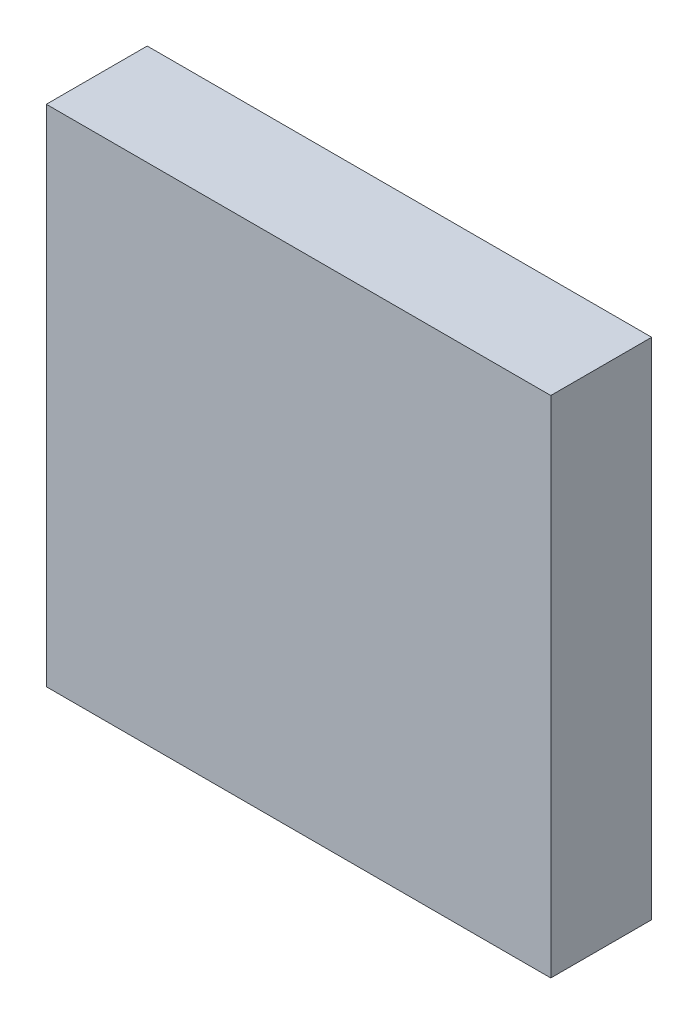
ISO-10303-21;
HEADER;
FILE_DESCRIPTION(('STEP AP214'),'2;1');
FILE_NAME('part.step','',(''),(''),'','','');
FILE_SCHEMA(('AUTOMOTIVE_DESIGN { 1 0 10303 214 1 1 1 1 }'));
ENDSEC;
DATA;
#1=APPLICATION_CONTEXT('core data for automotive mechanical design processes');
#2=APPLICATION_PROTOCOL_DEFINITION('international standard','automotive_design',2000,#1);
#3=PRODUCT_CONTEXT('',#1,'mechanical');
#4=PRODUCT('Part','Part','',(#3));
#5=PRODUCT_RELATED_PRODUCT_CATEGORY('part','',(#4));
#6=PRODUCT_DEFINITION_FORMATION('','',#4);
#7=PRODUCT_DEFINITION_CONTEXT('part definition',#1,'design');
#8=PRODUCT_DEFINITION('design','',#6,#7);
#9=PRODUCT_DEFINITION_SHAPE('','',#8);
#10=(LENGTH_UNIT() NAMED_UNIT(*) SI_UNIT(.MILLI.,.METRE.));
#11=(NAMED_UNIT(*) PLANE_ANGLE_UNIT() SI_UNIT($,.RADIAN.));
#12=(NAMED_UNIT(*) SI_UNIT($,.STERADIAN.) SOLID_ANGLE_UNIT());
#13=UNCERTAINTY_MEASURE_WITH_UNIT(LENGTH_MEASURE(1.E-05),#10,'distance_accuracy_value','');
#14=(GEOMETRIC_REPRESENTATION_CONTEXT(3) GLOBAL_UNCERTAINTY_ASSIGNED_CONTEXT((#13)) GLOBAL_UNIT_ASSIGNED_CONTEXT((#10,
#11,#12)) REPRESENTATION_CONTEXT('',''));
#15=CARTESIAN_POINT('',(0.,0.,0.));
#16=DIRECTION('',(0.,0.,1.));
#17=DIRECTION('',(1.,0.,0.));
#18=AXIS2_PLACEMENT_3D('',#15,#16,#17);
#19=CARTESIAN_POINT('',(-2.50001024,-2.50001024,1.00000054));
#20=DIRECTION('',(0.,0.,-1.));
#21=DIRECTION('',(-1.,0.,0.));
#22=AXIS2_PLACEMENT_3D('',#19,#20,#21);
#23=PLANE('',#22);
#24=DIRECTION('',(0.,1.,0.));
#25=VECTOR('',#24,1.);
#26=CARTESIAN_POINT('',(2.50001024,-2.50001024,1.00000054));
#27=LINE('',#26,#25);
#28=CARTESIAN_POINT('',(2.50001024,-2.50001024,1.00000054));
#29=VERTEX_POINT('',#28);
#30=CARTESIAN_POINT('',(2.50001024,2.50001024,1.00000054));
#31=VERTEX_POINT('',#30);
#32=EDGE_CURVE('E55',#29,#31,#27,.T.);
#33=ORIENTED_EDGE('',*,*,#32,.T.);
#34=DIRECTION('',(1.,0.,0.));
#35=VECTOR('',#34,1.);
#36=CARTESIAN_POINT('',(2.50001024,2.50001024,1.00000054));
#37=LINE('',#36,#35);
#38=CARTESIAN_POINT('',(-2.50001024,2.50001024,1.00000054));
#39=VERTEX_POINT('',#38);
#40=EDGE_CURVE('E57',#31,#39,#37,.F.);
#41=ORIENTED_EDGE('',*,*,#40,.T.);
#42=DIRECTION('',(0.,1.,0.));
#43=VECTOR('',#42,1.);
#44=CARTESIAN_POINT('',(-2.50001024,2.50001024,1.00000054));
#45=LINE('',#44,#43);
#46=CARTESIAN_POINT('',(-2.50001024,-2.50001024,1.00000054));
#47=VERTEX_POINT('',#46);
#48=EDGE_CURVE('E20',#39,#47,#45,.F.);
#49=ORIENTED_EDGE('',*,*,#48,.T.);
#50=DIRECTION('',(1.,0.,0.));
#51=VECTOR('',#50,1.);
#52=CARTESIAN_POINT('',(-2.50001024,-2.50001024,1.00000054));
#53=LINE('',#52,#51);
#54=EDGE_CURVE('E80',#47,#29,#53,.T.);
#55=ORIENTED_EDGE('',*,*,#54,.T.);
#56=EDGE_LOOP('',(#33,#41,#49,#55));
#57=FACE_BOUND('',#56,.T.);
#58=ADVANCED_FACE('F17',(#57),#23,.F.);
#59=CARTESIAN_POINT('',(-2.50001024,2.50001024,0.));
#60=DIRECTION('',(1.,0.,0.));
#61=DIRECTION('',(0.,0.,-1.));
#62=AXIS2_PLACEMENT_3D('',#59,#60,#61);
#63=PLANE('',#62);
#64=DIRECTION('',(0.,0.,1.));
#65=VECTOR('',#64,1.);
#66=CARTESIAN_POINT('',(-2.50001024,-2.50001024,0.));
#67=LINE('',#66,#65);
#68=CARTESIAN_POINT('',(-2.50001024,-2.50001024,0.));
#69=VERTEX_POINT('',#68);
#70=EDGE_CURVE('E68',#69,#47,#67,.T.);
#71=ORIENTED_EDGE('',*,*,#70,.T.);
#72=ORIENTED_EDGE('',*,*,#48,.F.);
#73=DIRECTION('',(0.,0.,-1.));
#74=VECTOR('',#73,1.);
#75=CARTESIAN_POINT('',(-2.50001024,2.50001024,0.));
#76=LINE('',#75,#74);
#77=CARTESIAN_POINT('',(-2.50001024,2.50001024,0.));
#78=VERTEX_POINT('',#77);
#79=EDGE_CURVE('E63',#39,#78,#76,.T.);
#80=ORIENTED_EDGE('',*,*,#79,.T.);
#81=DIRECTION('',(0.,1.,0.));
#82=VECTOR('',#81,1.);
#83=CARTESIAN_POINT('',(-2.50001024,-2.50001024,0.));
#84=LINE('',#83,#82);
#85=EDGE_CURVE('E83',#69,#78,#84,.T.);
#86=ORIENTED_EDGE('',*,*,#85,.F.);
#87=EDGE_LOOP('',(#71,#72,#80,#86));
#88=FACE_BOUND('',#87,.T.);
#89=ADVANCED_FACE('F65',(#88),#63,.F.);
#90=CARTESIAN_POINT('',(2.50001024,2.50001024,0.));
#91=DIRECTION('',(0.,-1.,0.));
#92=DIRECTION('',(0.,0.,-1.));
#93=AXIS2_PLACEMENT_3D('',#90,#91,#92);
#94=PLANE('',#93);
#95=ORIENTED_EDGE('',*,*,#79,.F.);
#96=ORIENTED_EDGE('',*,*,#40,.F.);
#97=DIRECTION('',(0.,0.,1.));
#98=VECTOR('',#97,1.);
#99=CARTESIAN_POINT('',(2.50001024,2.50001024,0.));
#100=LINE('',#99,#98);
#101=CARTESIAN_POINT('',(2.50001024,2.50001024,0.));
#102=VERTEX_POINT('',#101);
#103=EDGE_CURVE('E75',#31,#102,#100,.F.);
#104=ORIENTED_EDGE('',*,*,#103,.T.);
#105=DIRECTION('',(-1.,0.,0.));
#106=VECTOR('',#105,1.);
#107=CARTESIAN_POINT('',(-2.50001024,2.50001024,0.));
#108=LINE('',#107,#106);
#109=EDGE_CURVE('E72',#78,#102,#108,.F.);
#110=ORIENTED_EDGE('',*,*,#109,.F.);
#111=EDGE_LOOP('',(#95,#96,#104,#110));
#112=FACE_BOUND('',#111,.T.);
#113=ADVANCED_FACE('F70',(#112),#94,.F.);
#114=CARTESIAN_POINT('',(2.50001024,-2.50001024,0.));
#115=DIRECTION('',(-1.,0.,0.));
#116=DIRECTION('',(0.,0.,1.));
#117=AXIS2_PLACEMENT_3D('',#114,#115,#116);
#118=PLANE('',#117);
#119=ORIENTED_EDGE('',*,*,#103,.F.);
#120=ORIENTED_EDGE('',*,*,#32,.F.);
#121=DIRECTION('',(0.,0.,1.));
#122=VECTOR('',#121,1.);
#123=CARTESIAN_POINT('',(2.50001024,-2.50001024,0.));
#124=LINE('',#123,#122);
#125=CARTESIAN_POINT('',(2.50001024,-2.50001024,0.));
#126=VERTEX_POINT('',#125);
#127=EDGE_CURVE('E35',#29,#126,#124,.F.);
#128=ORIENTED_EDGE('',*,*,#127,.T.);
#129=DIRECTION('',(0.,1.,0.));
#130=VECTOR('',#129,1.);
#131=CARTESIAN_POINT('',(2.50001024,-2.50001024,0.));
#132=LINE('',#131,#130);
#133=EDGE_CURVE('E26',#102,#126,#132,.F.);
#134=ORIENTED_EDGE('',*,*,#133,.F.);
#135=EDGE_LOOP('',(#119,#120,#128,#134));
#136=FACE_BOUND('',#135,.T.);
#137=ADVANCED_FACE('F89',(#136),#118,.F.);
#138=CARTESIAN_POINT('',(-2.50001024,-2.50001024,0.));
#139=DIRECTION('',(0.,1.,0.));
#140=DIRECTION('',(0.,0.,1.));
#141=AXIS2_PLACEMENT_3D('',#138,#139,#140);
#142=PLANE('',#141);
#143=ORIENTED_EDGE('',*,*,#127,.F.);
#144=ORIENTED_EDGE('',*,*,#54,.F.);
#145=ORIENTED_EDGE('',*,*,#70,.F.);
#146=DIRECTION('',(-1.,0.,0.));
#147=VECTOR('',#146,1.);
#148=CARTESIAN_POINT('',(-2.50001024,-2.50001024,0.));
#149=LINE('',#148,#147);
#150=EDGE_CURVE('E11',#126,#69,#149,.T.);
#151=ORIENTED_EDGE('',*,*,#150,.F.);
#152=EDGE_LOOP('',(#143,#144,#145,#151));
#153=FACE_BOUND('',#152,.T.);
#154=ADVANCED_FACE('F91',(#153),#142,.F.);
#155=CARTESIAN_POINT('',(-2.50001024,-2.50001024,0.));
#156=DIRECTION('',(0.,0.,-1.));
#157=DIRECTION('',(-1.,0.,0.));
#158=AXIS2_PLACEMENT_3D('',#155,#156,#157);
#159=PLANE('',#158);
#160=ORIENTED_EDGE('',*,*,#133,.T.);
#161=ORIENTED_EDGE('',*,*,#150,.T.);
#162=ORIENTED_EDGE('',*,*,#85,.T.);
#163=ORIENTED_EDGE('',*,*,#109,.T.);
#164=EDGE_LOOP('',(#160,#161,#162,#163));
#165=FACE_BOUND('',#164,.T.);
#166=ADVANCED_FACE('F88',(#165),#159,.T.);
#167=CLOSED_SHELL('',(#58,#89,#113,#137,#154,#166));
#168=MANIFOLD_SOLID_BREP('B1',#167);
#169=ADVANCED_BREP_SHAPE_REPRESENTATION('',(#18,#168),#14);
#170=SHAPE_DEFINITION_REPRESENTATION(#9,#169);
ENDSEC;
END-ISO-10303-21;
